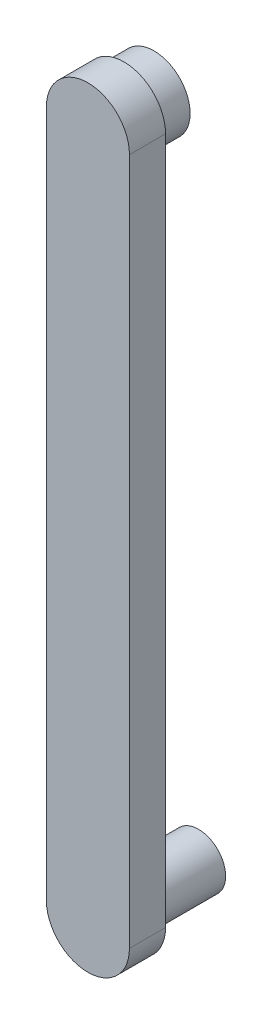
ISO-10303-21;
HEADER;
FILE_DESCRIPTION(('STEP AP214'),'2;1');
FILE_NAME('part.step','',(''),(''),'','','');
FILE_SCHEMA(('AUTOMOTIVE_DESIGN { 1 0 10303 214 1 1 1 1 }'));
ENDSEC;
DATA;
#1=APPLICATION_CONTEXT('core data for automotive mechanical design processes');
#2=APPLICATION_PROTOCOL_DEFINITION('international standard','automotive_design',2000,#1);
#3=PRODUCT_CONTEXT('',#1,'mechanical');
#4=PRODUCT('Part','Part','',(#3));
#5=PRODUCT_RELATED_PRODUCT_CATEGORY('part','',(#4));
#6=PRODUCT_DEFINITION_FORMATION('','',#4);
#7=PRODUCT_DEFINITION_CONTEXT('part definition',#1,'design');
#8=PRODUCT_DEFINITION('design','',#6,#7);
#9=PRODUCT_DEFINITION_SHAPE('','',#8);
#10=(LENGTH_UNIT() NAMED_UNIT(*) SI_UNIT(.MILLI.,.METRE.));
#11=(NAMED_UNIT(*) PLANE_ANGLE_UNIT() SI_UNIT($,.RADIAN.));
#12=(NAMED_UNIT(*) SI_UNIT($,.STERADIAN.) SOLID_ANGLE_UNIT());
#13=UNCERTAINTY_MEASURE_WITH_UNIT(LENGTH_MEASURE(1.E-05),#10,'distance_accuracy_value','');
#14=(GEOMETRIC_REPRESENTATION_CONTEXT(3) GLOBAL_UNCERTAINTY_ASSIGNED_CONTEXT((#13)) GLOBAL_UNIT_ASSIGNED_CONTEXT((#10,
#11,#12)) REPRESENTATION_CONTEXT('',''));
#15=CARTESIAN_POINT('',(0.,0.,0.));
#16=DIRECTION('',(0.,0.,1.));
#17=DIRECTION('',(1.,0.,0.));
#18=AXIS2_PLACEMENT_3D('',#15,#16,#17);
#19=CARTESIAN_POINT('',(115.,0.,100.));
#20=DIRECTION('',(-1.,0.,0.));
#21=DIRECTION('',(0.,-1.,0.));
#22=AXIS2_PLACEMENT_3D('',#19,#20,#21);
#23=PLANE('',#22);
#24=DIRECTION('',(0.,1.,0.));
#25=VECTOR('',#24,1.);
#26=CARTESIAN_POINT('',(115.,0.,0.));
#27=LINE('',#26,#25);
#28=CARTESIAN_POINT('',(115.,0.,0.));
#29=VERTEX_POINT('',#28);
#30=CARTESIAN_POINT('',(115.,1903.73,0.));
#31=VERTEX_POINT('',#30);
#32=EDGE_CURVE('E96',#29,#31,#27,.T.);
#33=ORIENTED_EDGE('',*,*,#32,.T.);
#34=DIRECTION('',(0.,0.,-1.));
#35=VECTOR('',#34,1.);
#36=CARTESIAN_POINT('',(115.,1903.73,100.));
#37=LINE('',#36,#35);
#38=CARTESIAN_POINT('',(115.,1903.73,100.));
#39=VERTEX_POINT('',#38);
#40=EDGE_CURVE('E11',#39,#31,#37,.T.);
#41=ORIENTED_EDGE('',*,*,#40,.F.);
#42=DIRECTION('',(0.,1.,0.));
#43=VECTOR('',#42,1.);
#44=CARTESIAN_POINT('',(115.,0.,100.));
#45=LINE('',#44,#43);
#46=CARTESIAN_POINT('',(115.,0.,100.));
#47=VERTEX_POINT('',#46);
#48=EDGE_CURVE('E81',#47,#39,#45,.T.);
#49=ORIENTED_EDGE('',*,*,#48,.F.);
#50=DIRECTION('',(0.,0.,-1.));
#51=VECTOR('',#50,1.);
#52=CARTESIAN_POINT('',(115.,0.,100.));
#53=LINE('',#52,#51);
#54=EDGE_CURVE('E92',#47,#29,#53,.T.);
#55=ORIENTED_EDGE('',*,*,#54,.T.);
#56=EDGE_LOOP('',(#33,#41,#49,#55));
#57=FACE_BOUND('',#56,.T.);
#58=ADVANCED_FACE('F34',(#57),#23,.F.);
#59=CARTESIAN_POINT('',(0.,1903.73,100.));
#60=DIRECTION('',(0.,0.,-1.));
#61=DIRECTION('',(-1.,0.,0.));
#62=AXIS2_PLACEMENT_3D('',#59,#60,#61);
#63=CYLINDRICAL_SURFACE('',#62,115.);
#64=CARTESIAN_POINT('',(0.,1903.73,0.));
#65=DIRECTION('',(0.,0.,1.));
#66=DIRECTION('',(1.,0.,0.));
#67=AXIS2_PLACEMENT_3D('',#64,#65,#66);
#68=CIRCLE('',#67,115.);
#69=CARTESIAN_POINT('',(-115.,1903.73,0.));
#70=VERTEX_POINT('',#69);
#71=EDGE_CURVE('E86',#31,#70,#68,.T.);
#72=ORIENTED_EDGE('',*,*,#71,.T.);
#73=DIRECTION('',(0.,0.,-1.));
#74=VECTOR('',#73,1.);
#75=CARTESIAN_POINT('',(-115.,1903.73,100.));
#76=LINE('',#75,#74);
#77=CARTESIAN_POINT('',(-115.,1903.73,100.));
#78=VERTEX_POINT('',#77);
#79=EDGE_CURVE('E42',#78,#70,#76,.T.);
#80=ORIENTED_EDGE('',*,*,#79,.F.);
#81=CARTESIAN_POINT('',(0.,1903.73,100.));
#82=DIRECTION('',(0.,0.,1.));
#83=DIRECTION('',(1.,0.,0.));
#84=AXIS2_PLACEMENT_3D('',#81,#82,#83);
#85=CIRCLE('',#84,115.);
#86=EDGE_CURVE('E76',#39,#78,#85,.T.);
#87=ORIENTED_EDGE('',*,*,#86,.F.);
#88=ORIENTED_EDGE('',*,*,#40,.T.);
#89=EDGE_LOOP('',(#72,#80,#87,#88));
#90=FACE_BOUND('',#89,.T.);
#91=ADVANCED_FACE('F85',(#90),#63,.T.);
#92=CARTESIAN_POINT('',(-115.,0.,100.));
#93=DIRECTION('',(-1.,0.,0.));
#94=DIRECTION('',(0.,-1.,0.));
#95=AXIS2_PLACEMENT_3D('',#92,#93,#94);
#96=PLANE('',#95);
#97=DIRECTION('',(0.,1.,0.));
#98=VECTOR('',#97,1.);
#99=CARTESIAN_POINT('',(-115.,0.,0.));
#100=LINE('',#99,#98);
#101=CARTESIAN_POINT('',(-115.,0.,0.));
#102=VERTEX_POINT('',#101);
#103=EDGE_CURVE('E101',#102,#70,#100,.T.);
#104=ORIENTED_EDGE('',*,*,#103,.F.);
#105=DIRECTION('',(0.,0.,-1.));
#106=VECTOR('',#105,1.);
#107=CARTESIAN_POINT('',(-115.,0.,100.));
#108=LINE('',#107,#106);
#109=CARTESIAN_POINT('',(-115.,0.,100.));
#110=VERTEX_POINT('',#109);
#111=EDGE_CURVE('E66',#110,#102,#108,.T.);
#112=ORIENTED_EDGE('',*,*,#111,.F.);
#113=DIRECTION('',(0.,1.,0.));
#114=VECTOR('',#113,1.);
#115=CARTESIAN_POINT('',(-115.,0.,100.));
#116=LINE('',#115,#114);
#117=EDGE_CURVE('E79',#110,#78,#116,.T.);
#118=ORIENTED_EDGE('',*,*,#117,.T.);
#119=ORIENTED_EDGE('',*,*,#79,.T.);
#120=EDGE_LOOP('',(#104,#112,#118,#119));
#121=FACE_BOUND('',#120,.T.);
#122=ADVANCED_FACE('F90',(#121),#96,.T.);
#123=CARTESIAN_POINT('',(0.,0.,100.));
#124=DIRECTION('',(0.,0.,-1.));
#125=DIRECTION('',(-1.,0.,0.));
#126=AXIS2_PLACEMENT_3D('',#123,#124,#125);
#127=CYLINDRICAL_SURFACE('',#126,115.);
#128=CARTESIAN_POINT('',(0.,0.,0.));
#129=DIRECTION('',(0.,0.,1.));
#130=DIRECTION('',(1.,0.,0.));
#131=AXIS2_PLACEMENT_3D('',#128,#129,#130);
#132=CIRCLE('',#131,115.);
#133=EDGE_CURVE('E69',#102,#29,#132,.T.);
#134=ORIENTED_EDGE('',*,*,#133,.T.);
#135=ORIENTED_EDGE('',*,*,#54,.F.);
#136=CARTESIAN_POINT('',(0.,0.,100.));
#137=DIRECTION('',(0.,0.,1.));
#138=DIRECTION('',(1.,0.,0.));
#139=AXIS2_PLACEMENT_3D('',#136,#137,#138);
#140=CIRCLE('',#139,115.);
#141=EDGE_CURVE('E50',#110,#47,#140,.T.);
#142=ORIENTED_EDGE('',*,*,#141,.F.);
#143=ORIENTED_EDGE('',*,*,#111,.T.);
#144=EDGE_LOOP('',(#134,#135,#142,#143));
#145=FACE_BOUND('',#144,.T.);
#146=ADVANCED_FACE('F120',(#145),#127,.T.);
#147=CARTESIAN_POINT('',(0.,1903.73,100.));
#148=DIRECTION('',(0.,0.,1.));
#149=DIRECTION('',(1.,0.,0.));
#150=AXIS2_PLACEMENT_3D('',#147,#148,#149);
#151=PLANE('',#150);
#152=ORIENTED_EDGE('',*,*,#48,.T.);
#153=ORIENTED_EDGE('',*,*,#86,.T.);
#154=ORIENTED_EDGE('',*,*,#117,.F.);
#155=ORIENTED_EDGE('',*,*,#141,.T.);
#156=EDGE_LOOP('',(#152,#153,#154,#155));
#157=FACE_BOUND('',#156,.T.);
#158=ADVANCED_FACE('F77',(#157),#151,.T.);
#159=CARTESIAN_POINT('',(0.,1903.73,0.));
#160=DIRECTION('',(0.,0.,1.));
#161=DIRECTION('',(1.,0.,0.));
#162=AXIS2_PLACEMENT_3D('',#159,#160,#161);
#163=PLANE('',#162);
#164=CARTESIAN_POINT('',(0.,0.,0.));
#165=DIRECTION('',(0.,0.,1.));
#166=DIRECTION('',(1.,0.,0.));
#167=AXIS2_PLACEMENT_3D('',#164,#165,#166);
#168=CIRCLE('',#167,75.);
#169=CARTESIAN_POINT('',(75.,0.,0.));
#170=VERTEX_POINT('',#169);
#171=EDGE_CURVE('E189',#170,#170,#168,.T.);
#172=ORIENTED_EDGE('',*,*,#171,.T.);
#173=EDGE_LOOP('',(#172));
#174=FACE_BOUND('',#173,.T.);
#175=CARTESIAN_POINT('',(0.,1903.73,0.));
#176=DIRECTION('',(0.,0.,1.));
#177=DIRECTION('',(1.,0.,0.));
#178=AXIS2_PLACEMENT_3D('',#175,#176,#177);
#179=CIRCLE('',#178,100.);
#180=CARTESIAN_POINT('',(100.,1903.73,0.));
#181=VERTEX_POINT('',#180);
#182=EDGE_CURVE('E188',#181,#181,#179,.T.);
#183=ORIENTED_EDGE('',*,*,#182,.T.);
#184=EDGE_LOOP('',(#183));
#185=FACE_BOUND('',#184,.T.);
#186=ORIENTED_EDGE('',*,*,#32,.F.);
#187=ORIENTED_EDGE('',*,*,#133,.F.);
#188=ORIENTED_EDGE('',*,*,#103,.T.);
#189=ORIENTED_EDGE('',*,*,#71,.F.);
#190=EDGE_LOOP('',(#186,#187,#188,#189));
#191=FACE_BOUND('',#190,.T.);
#192=ADVANCED_FACE('F108',(#174,#185,#191),#163,.F.);
#193=CARTESIAN_POINT('',(0.,1903.73,-83.1000650201544));
#194=DIRECTION('',(0.,0.,1.));
#195=DIRECTION('',(1.,0.,0.));
#196=AXIS2_PLACEMENT_3D('',#193,#194,#195);
#197=CYLINDRICAL_SURFACE('',#196,100.);
#198=CARTESIAN_POINT('',(0.,1903.73,-83.1000650201544));
#199=DIRECTION('',(0.,0.,1.));
#200=DIRECTION('',(1.,0.,0.));
#201=AXIS2_PLACEMENT_3D('',#198,#199,#200);
#202=CIRCLE('',#201,100.);
#203=CARTESIAN_POINT('',(100.,1903.73,-83.1000650201544));
#204=VERTEX_POINT('',#203);
#205=EDGE_CURVE('E99',#204,#204,#202,.T.);
#206=ORIENTED_EDGE('',*,*,#205,.T.);
#207=EDGE_LOOP('',(#206));
#208=FACE_BOUND('',#207,.T.);
#209=ORIENTED_EDGE('',*,*,#182,.F.);
#210=EDGE_LOOP('',(#209));
#211=FACE_BOUND('',#210,.T.);
#212=ADVANCED_FACE('F110',(#208,#211),#197,.T.);
#213=CARTESIAN_POINT('',(0.,0.,-83.1000650201544));
#214=DIRECTION('',(0.,0.,1.));
#215=DIRECTION('',(1.,0.,0.));
#216=AXIS2_PLACEMENT_3D('',#213,#214,#215);
#217=PLANE('',#216);
#218=ORIENTED_EDGE('',*,*,#205,.F.);
#219=EDGE_LOOP('',(#218));
#220=FACE_BOUND('',#219,.T.);
#221=ADVANCED_FACE('F117',(#220),#217,.F.);
#222=CARTESIAN_POINT('',(0.,0.,-206.380604417633));
#223=DIRECTION('',(0.,0.,1.));
#224=DIRECTION('',(1.,0.,0.));
#225=AXIS2_PLACEMENT_3D('',#222,#223,#224);
#226=CYLINDRICAL_SURFACE('',#225,75.);
#227=CARTESIAN_POINT('',(0.,0.,-206.380604417633));
#228=DIRECTION('',(0.,0.,1.));
#229=DIRECTION('',(1.,0.,0.));
#230=AXIS2_PLACEMENT_3D('',#227,#228,#229);
#231=CIRCLE('',#230,75.);
#232=CARTESIAN_POINT('',(75.,0.,-206.380604417633));
#233=VERTEX_POINT('',#232);
#234=EDGE_CURVE('E187',#233,#233,#231,.T.);
#235=CARTESIAN_POINT('',(75.,0.,-206.380604417633));
#236=CARTESIAN_POINT('',(75.,0.,-204.230806454949));
#237=CARTESIAN_POINT('',(75.,0.,-202.081008492265));
#238=CARTESIAN_POINT('',(75.,0.,-197.781412566898));
#239=CARTESIAN_POINT('',(75.,0.,-195.631614604214));
#240=CARTESIAN_POINT('',(75.,0.,-191.332018678847));
#241=CARTESIAN_POINT('',(75.,0.,-189.182220716163));
#242=CARTESIAN_POINT('',(75.,0.,-184.882624790796));
#243=CARTESIAN_POINT('',(75.,0.,-182.732826828112));
#244=CARTESIAN_POINT('',(75.,0.,-178.433230902745));
#245=CARTESIAN_POINT('',(75.,0.,-176.283432940061));
#246=CARTESIAN_POINT('',(75.,0.,-171.983837014694));
#247=CARTESIAN_POINT('',(75.,0.,-169.83403905201));
#248=CARTESIAN_POINT('',(75.,0.,-165.534443126643));
#249=CARTESIAN_POINT('',(75.,0.,-163.384645163959));
#250=CARTESIAN_POINT('',(75.,0.,-159.085049238592));
#251=CARTESIAN_POINT('',(75.,0.,-156.935251275908));
#252=CARTESIAN_POINT('',(75.,0.,-152.635655350541));
#253=CARTESIAN_POINT('',(75.,0.,-150.485857387857));
#254=CARTESIAN_POINT('',(75.,0.,-146.18626146249));
#255=CARTESIAN_POINT('',(75.,0.,-144.036463499806));
#256=CARTESIAN_POINT('',(75.,0.,-139.736867574439));
#257=CARTESIAN_POINT('',(75.,0.,-137.587069611755));
#258=CARTESIAN_POINT('',(75.,0.,-133.287473686388));
#259=CARTESIAN_POINT('',(75.,0.,-131.137675723704));
#260=CARTESIAN_POINT('',(75.,0.,-126.838079798337));
#261=CARTESIAN_POINT('',(75.,0.,-124.688281835653));
#262=CARTESIAN_POINT('',(75.,0.,-120.388685910286));
#263=CARTESIAN_POINT('',(75.,0.,-118.238887947602));
#264=CARTESIAN_POINT('',(75.,0.,-113.939292022235));
#265=CARTESIAN_POINT('',(75.,0.,-111.789494059551));
#266=CARTESIAN_POINT('',(75.,0.,-107.489898134184));
#267=CARTESIAN_POINT('',(75.,0.,-105.3401001715));
#268=CARTESIAN_POINT('',(75.,0.,-101.040504246133));
#269=CARTESIAN_POINT('',(75.,0.,-98.890706283449));
#270=CARTESIAN_POINT('',(75.,0.,-94.5911103580817));
#271=CARTESIAN_POINT('',(75.,0.,-92.441312395398));
#272=CARTESIAN_POINT('',(75.,0.,-88.1417164700306));
#273=CARTESIAN_POINT('',(75.,0.,-85.991918507347));
#274=CARTESIAN_POINT('',(75.,0.,-81.6923225819796));
#275=CARTESIAN_POINT('',(75.,0.,-79.5425246192959));
#276=CARTESIAN_POINT('',(75.,0.,-75.2429286939286));
#277=CARTESIAN_POINT('',(75.,0.,-73.0931307312449));
#278=CARTESIAN_POINT('',(75.,0.,-68.7935348058776));
#279=CARTESIAN_POINT('',(75.,0.,-66.6437368431939));
#280=CARTESIAN_POINT('',(75.,0.,-62.3441409178266));
#281=CARTESIAN_POINT('',(75.,0.,-60.1943429551429));
#282=CARTESIAN_POINT('',(75.,0.,-55.8947470297756));
#283=CARTESIAN_POINT('',(75.,0.,-53.7449490670919));
#284=CARTESIAN_POINT('',(75.,0.,-49.4453531417245));
#285=CARTESIAN_POINT('',(75.,0.,-47.2955551790409));
#286=CARTESIAN_POINT('',(75.,0.,-42.9959592536735));
#287=CARTESIAN_POINT('',(75.,0.,-40.8461612909898));
#288=CARTESIAN_POINT('',(75.,0.,-36.5465653656225));
#289=CARTESIAN_POINT('',(75.,0.,-34.3967674029388));
#290=CARTESIAN_POINT('',(75.,0.,-30.0971714775715));
#291=CARTESIAN_POINT('',(75.,0.,-27.9473735148878));
#292=CARTESIAN_POINT('',(75.,0.,-23.6477775895204));
#293=CARTESIAN_POINT('',(75.,0.,-21.4979796268368));
#294=CARTESIAN_POINT('',(75.,0.,-17.1983837014694));
#295=CARTESIAN_POINT('',(75.,0.,-15.0485857387857));
#296=CARTESIAN_POINT('',(75.,0.,-10.7489898134184));
#297=CARTESIAN_POINT('',(75.,0.,-8.59919185073472));
#298=CARTESIAN_POINT('',(75.,0.,-4.29959592536737));
#299=CARTESIAN_POINT('',(75.,0.,-2.1497979626837));
#300=CARTESIAN_POINT('',(75.,0.,0.));
#301=B_SPLINE_CURVE_WITH_KNOTS('',3,(#235,#236,#237,#238,#239,#240,#241,#242,#243,#244,#245,
#246,#247,#248,#249,#250,#251,#252,#253,#254,#255,#256,#257,#258,#259,#260,#261,#262,#263,#264,
#265,#266,#267,#268,#269,#270,#271,#272,#273,#274,#275,#276,#277,#278,#279,#280,#281,#282,#283,
#284,#285,#286,#287,#288,#289,#290,#291,#292,#293,#294,#295,#296,#297,#298,#299,#300),
.UNSPECIFIED.,.F.,.F.,(4,2,2,2,2,2,2,2,2,2,2,2,2,2,2,2,2,2,2,2,2,2,2,2,2,2,2,2,2,2,2,2,4),(0.,
6.44939388805105,12.8987877761021,19.3481816641531,25.7975755522041,32.2469694402551,
38.6963633283061,45.1457572163572,51.5951511044082,58.0445449924592,64.4939388805102,
70.9433327685612,77.3927266566123,83.8421205446633,90.2915144327143,96.7409083207653,
103.190302208816,109.639696096867,116.089089984918,122.538483872969,128.98787776102,
135.437271649071,141.886665537122,148.336059425173,154.785453313224,161.234847201275,
167.684241089327,174.133634977378,180.583028865429,187.03242275348,193.481816641531,
199.931210529582,206.380604417633),.UNSPECIFIED.);
#302=EDGE_CURVE('BSEAM157',#233,#170,#301,.T.);
#303=ORIENTED_EDGE('',*,*,#234,.T.);
#304=ORIENTED_EDGE('',*,*,#171,.F.);
#305=ORIENTED_EDGE('',*,*,#302,.T.);
#306=ORIENTED_EDGE('',*,*,#302,.F.);
#307=EDGE_LOOP('',(#303,#305,#304,#306));
#308=FACE_BOUND('',#307,.T.);
#309=ADVANCED_FACE('F157',(#308),#226,.T.);
#310=CARTESIAN_POINT('',(0.,0.,-206.380604417633));
#311=DIRECTION('',(0.,0.,1.));
#312=DIRECTION('',(1.,0.,0.));
#313=AXIS2_PLACEMENT_3D('',#310,#311,#312);
#314=PLANE('',#313);
#315=ORIENTED_EDGE('',*,*,#234,.F.);
#316=EDGE_LOOP('',(#315));
#317=FACE_BOUND('',#316,.T.);
#318=ADVANCED_FACE('F171',(#317),#314,.F.);
#319=CLOSED_SHELL('',(#58,#91,#122,#146,#158,#192,#212,#221,#309,#318));
#320=MANIFOLD_SOLID_BREP('B2',#319);
#321=ADVANCED_BREP_SHAPE_REPRESENTATION('',(#18,#320),#14);
#322=SHAPE_DEFINITION_REPRESENTATION(#9,#321);
ENDSEC;
END-ISO-10303-21;
